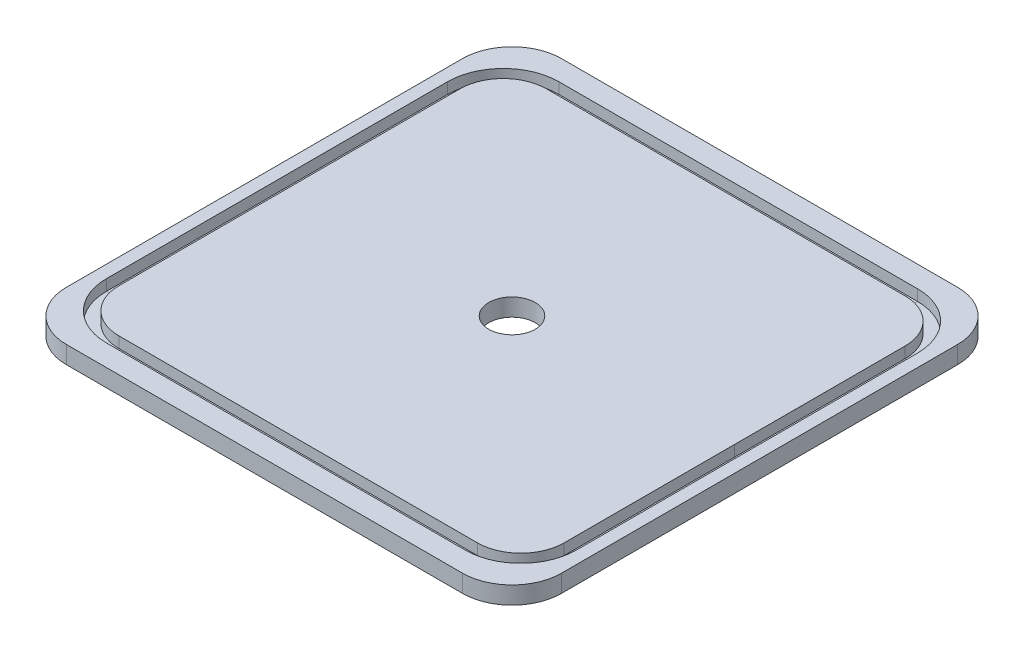
ISO-10303-21;
HEADER;
FILE_DESCRIPTION(('STEP AP214'),'2;1');
FILE_NAME('part.step','',(''),(''),'','','');
FILE_SCHEMA(('AUTOMOTIVE_DESIGN { 1 0 10303 214 1 1 1 1 }'));
ENDSEC;
DATA;
#1=APPLICATION_CONTEXT('core data for automotive mechanical design processes');
#2=APPLICATION_PROTOCOL_DEFINITION('international standard','automotive_design',2000,#1);
#3=PRODUCT_CONTEXT('',#1,'mechanical');
#4=PRODUCT('Part','Part','',(#3));
#5=PRODUCT_RELATED_PRODUCT_CATEGORY('part','',(#4));
#6=PRODUCT_DEFINITION_FORMATION('','',#4);
#7=PRODUCT_DEFINITION_CONTEXT('part definition',#1,'design');
#8=PRODUCT_DEFINITION('design','',#6,#7);
#9=PRODUCT_DEFINITION_SHAPE('','',#8);
#10=(LENGTH_UNIT() NAMED_UNIT(*) SI_UNIT(.MILLI.,.METRE.));
#11=(NAMED_UNIT(*) PLANE_ANGLE_UNIT() SI_UNIT($,.RADIAN.));
#12=(NAMED_UNIT(*) SI_UNIT($,.STERADIAN.) SOLID_ANGLE_UNIT());
#13=UNCERTAINTY_MEASURE_WITH_UNIT(LENGTH_MEASURE(1.E-05),#10,'distance_accuracy_value','');
#14=(GEOMETRIC_REPRESENTATION_CONTEXT(3) GLOBAL_UNCERTAINTY_ASSIGNED_CONTEXT((#13)) GLOBAL_UNIT_ASSIGNED_CONTEXT((#10,
#11,#12)) REPRESENTATION_CONTEXT('',''));
#15=CARTESIAN_POINT('',(0.,0.,0.));
#16=DIRECTION('',(0.,0.,1.));
#17=DIRECTION('',(1.,0.,0.));
#18=AXIS2_PLACEMENT_3D('',#15,#16,#17);
#19=CARTESIAN_POINT('',(50.8,2.25,50.8));
#20=DIRECTION('',(0.,1.,0.));
#21=DIRECTION('',(0.,0.,1.));
#22=AXIS2_PLACEMENT_3D('',#19,#20,#21);
#23=PLANE('',#22);
#24=DIRECTION('',(0.,0.,1.));
#25=VECTOR('',#24,1.);
#26=CARTESIAN_POINT('',(60.2809892067048,2.25,-43.7388));
#27=LINE('',#26,#25);
#28=CARTESIAN_POINT('',(60.2809892067048,2.25,-43.7388));
#29=VERTEX_POINT('',#28);
#30=CARTESIAN_POINT('',(60.2809892067048,2.25,0.));
#31=VERTEX_POINT('',#30);
#32=EDGE_CURVE('E364',#29,#31,#27,.T.);
#33=ORIENTED_EDGE('',*,*,#32,.T.);
#34=DIRECTION('',(0.,0.,1.));
#35=VECTOR('',#34,1.);
#36=CARTESIAN_POINT('',(60.2809892067048,2.25,0.));
#37=LINE('',#36,#35);
#38=CARTESIAN_POINT('',(60.2809892067048,2.25,43.7388));
#39=VERTEX_POINT('',#38);
#40=EDGE_CURVE('E253',#31,#39,#37,.T.);
#41=ORIENTED_EDGE('',*,*,#40,.T.);
#42=CARTESIAN_POINT('',(45.9922192067048,2.25,43.7388));
#43=DIRECTION('',(0.,-1.,0.));
#44=DIRECTION('',(1.,0.,0.));
#45=AXIS2_PLACEMENT_3D('',#42,#43,#44);
#46=CIRCLE('',#45,14.28877);
#47=CARTESIAN_POINT('',(45.9922192067048,2.25,58.02757));
#48=VERTEX_POINT('',#47);
#49=EDGE_CURVE('E264',#39,#48,#46,.T.);
#50=ORIENTED_EDGE('',*,*,#49,.T.);
#51=DIRECTION('',(-1.,0.,0.));
#52=VECTOR('',#51,1.);
#53=CARTESIAN_POINT('',(45.9922192067048,2.25,58.02757));
#54=LINE('',#53,#52);
#55=CARTESIAN_POINT('',(-45.9922192067048,2.25,58.02757));
#56=VERTEX_POINT('',#55);
#57=EDGE_CURVE('E275',#48,#56,#54,.T.);
#58=ORIENTED_EDGE('',*,*,#57,.T.);
#59=CARTESIAN_POINT('',(-45.9922192067048,2.25,43.7388));
#60=DIRECTION('',(0.,-1.,0.));
#61=DIRECTION('',(0.,0.,1.));
#62=AXIS2_PLACEMENT_3D('',#59,#60,#61);
#63=CIRCLE('',#62,14.28877);
#64=CARTESIAN_POINT('',(-60.2809892067048,2.25,43.7388));
#65=VERTEX_POINT('',#64);
#66=EDGE_CURVE('E286',#56,#65,#63,.T.);
#67=ORIENTED_EDGE('',*,*,#66,.T.);
#68=DIRECTION('',(0.,0.,-1.));
#69=VECTOR('',#68,1.);
#70=CARTESIAN_POINT('',(-60.2809892067048,2.25,43.7388));
#71=LINE('',#70,#69);
#72=CARTESIAN_POINT('',(-60.2809892067048,2.25,-43.7388));
#73=VERTEX_POINT('',#72);
#74=EDGE_CURVE('E280',#65,#73,#71,.T.);
#75=ORIENTED_EDGE('',*,*,#74,.T.);
#76=CARTESIAN_POINT('',(-45.9922192067048,2.25,-43.7388));
#77=DIRECTION('',(0.,-1.,0.));
#78=DIRECTION('',(-1.,0.,0.));
#79=AXIS2_PLACEMENT_3D('',#76,#77,#78);
#80=CIRCLE('',#79,14.28877);
#81=CARTESIAN_POINT('',(-45.9922192067048,2.25,-58.02757));
#82=VERTEX_POINT('',#81);
#83=EDGE_CURVE('E308',#73,#82,#80,.T.);
#84=ORIENTED_EDGE('',*,*,#83,.T.);
#85=DIRECTION('',(1.,0.,0.));
#86=VECTOR('',#85,1.);
#87=CARTESIAN_POINT('',(-45.9922192067048,2.25,-58.02757));
#88=LINE('',#87,#86);
#89=CARTESIAN_POINT('',(45.9922192067048,2.25,-58.02757));
#90=VERTEX_POINT('',#89);
#91=EDGE_CURVE('E315',#82,#90,#88,.T.);
#92=ORIENTED_EDGE('',*,*,#91,.T.);
#93=CARTESIAN_POINT('',(45.9922192067048,2.25,-43.7388));
#94=DIRECTION('',(0.,-1.,0.));
#95=DIRECTION('',(0.,0.,-1.));
#96=AXIS2_PLACEMENT_3D('',#93,#94,#95);
#97=CIRCLE('',#96,14.28877);
#98=EDGE_CURVE('E218',#90,#29,#97,.T.);
#99=ORIENTED_EDGE('',*,*,#98,.T.);
#100=EDGE_LOOP('',(#33,#41,#50,#58,#67,#75,#84,#92,#99));
#101=FACE_BOUND('',#100,.T.);
#102=CARTESIAN_POINT('',(50.8,2.25,50.8));
#103=DIRECTION('',(0.,1.,0.));
#104=DIRECTION('',(0.,0.,1.));
#105=AXIS2_PLACEMENT_3D('',#102,#103,#104);
#106=CIRCLE('',#105,12.7);
#107=CARTESIAN_POINT('',(50.8,2.25,63.5));
#108=VERTEX_POINT('',#107);
#109=CARTESIAN_POINT('',(63.5,2.25,50.8));
#110=VERTEX_POINT('',#109);
#111=EDGE_CURVE('E406',#108,#110,#106,.T.);
#112=ORIENTED_EDGE('',*,*,#111,.T.);
#113=DIRECTION('',(0.,0.,-1.));
#114=VECTOR('',#113,1.);
#115=CARTESIAN_POINT('',(63.5,2.25,50.8));
#116=LINE('',#115,#114);
#117=CARTESIAN_POINT('',(63.5,2.25,-50.8000000000001));
#118=VERTEX_POINT('',#117);
#119=EDGE_CURVE('E409',#110,#118,#116,.T.);
#120=ORIENTED_EDGE('',*,*,#119,.T.);
#121=CARTESIAN_POINT('',(50.8,2.25,-50.8));
#122=DIRECTION('',(0.,1.,0.));
#123=DIRECTION('',(0.,0.,1.));
#124=AXIS2_PLACEMENT_3D('',#121,#122,#123);
#125=CIRCLE('',#124,12.7);
#126=CARTESIAN_POINT('',(50.7999999999999,2.25,-63.5));
#127=VERTEX_POINT('',#126);
#128=EDGE_CURVE('E412',#118,#127,#125,.T.);
#129=ORIENTED_EDGE('',*,*,#128,.T.);
#130=DIRECTION('',(-1.,0.,0.));
#131=VECTOR('',#130,1.);
#132=CARTESIAN_POINT('',(50.7999999999999,2.25,-63.5));
#133=LINE('',#132,#131);
#134=CARTESIAN_POINT('',(-50.7999999999999,2.25,-63.5));
#135=VERTEX_POINT('',#134);
#136=EDGE_CURVE('E414',#127,#135,#133,.T.);
#137=ORIENTED_EDGE('',*,*,#136,.T.);
#138=CARTESIAN_POINT('',(-50.8,2.25,-50.8));
#139=DIRECTION('',(0.,1.,0.));
#140=DIRECTION('',(0.,0.,-1.));
#141=AXIS2_PLACEMENT_3D('',#138,#139,#140);
#142=CIRCLE('',#141,12.7);
#143=CARTESIAN_POINT('',(-63.5,2.25,-50.8000000000001));
#144=VERTEX_POINT('',#143);
#145=EDGE_CURVE('E416',#135,#144,#142,.T.);
#146=ORIENTED_EDGE('',*,*,#145,.T.);
#147=DIRECTION('',(0.,0.,1.));
#148=VECTOR('',#147,1.);
#149=CARTESIAN_POINT('',(-63.5,2.25,-50.8000000000001));
#150=LINE('',#149,#148);
#151=CARTESIAN_POINT('',(-63.5,2.25,50.8));
#152=VERTEX_POINT('',#151);
#153=EDGE_CURVE('E418',#144,#152,#150,.T.);
#154=ORIENTED_EDGE('',*,*,#153,.T.);
#155=CARTESIAN_POINT('',(-50.8,2.25,50.8));
#156=DIRECTION('',(0.,1.,0.));
#157=DIRECTION('',(0.,0.,1.));
#158=AXIS2_PLACEMENT_3D('',#155,#156,#157);
#159=CIRCLE('',#158,12.7);
#160=CARTESIAN_POINT('',(-50.7999999999999,2.25,63.5));
#161=VERTEX_POINT('',#160);
#162=EDGE_CURVE('E420',#152,#161,#159,.T.);
#163=ORIENTED_EDGE('',*,*,#162,.T.);
#164=DIRECTION('',(1.,0.,0.));
#165=VECTOR('',#164,1.);
#166=CARTESIAN_POINT('',(-50.7999999999999,2.25,63.5));
#167=LINE('',#166,#165);
#168=EDGE_CURVE('E422',#161,#108,#167,.T.);
#169=ORIENTED_EDGE('',*,*,#168,.T.);
#170=EDGE_LOOP('',(#112,#120,#129,#137,#146,#154,#163,#169));
#171=FACE_BOUND('',#170,.T.);
#172=ADVANCED_FACE('F35',(#101,#171),#23,.T.);
#173=CARTESIAN_POINT('',(50.8,2.25,50.8));
#174=DIRECTION('',(0.,-1.,0.));
#175=DIRECTION('',(0.,0.,-1.));
#176=AXIS2_PLACEMENT_3D('',#173,#174,#175);
#177=CYLINDRICAL_SURFACE('',#176,12.7);
#178=CARTESIAN_POINT('',(50.8,-2.25,50.8));
#179=DIRECTION('',(0.,1.,0.));
#180=DIRECTION('',(0.,0.,1.));
#181=AXIS2_PLACEMENT_3D('',#178,#179,#180);
#182=CIRCLE('',#181,12.7);
#183=CARTESIAN_POINT('',(50.8,-2.25,63.5));
#184=VERTEX_POINT('',#183);
#185=CARTESIAN_POINT('',(63.5,-2.25,50.8));
#186=VERTEX_POINT('',#185);
#187=EDGE_CURVE('E405',#184,#186,#182,.T.);
#188=ORIENTED_EDGE('',*,*,#187,.T.);
#189=DIRECTION('',(0.,-1.,0.));
#190=VECTOR('',#189,1.);
#191=CARTESIAN_POINT('',(63.5,2.25,50.8));
#192=LINE('',#191,#190);
#193=EDGE_CURVE('E11',#110,#186,#192,.T.);
#194=ORIENTED_EDGE('',*,*,#193,.F.);
#195=ORIENTED_EDGE('',*,*,#111,.F.);
#196=DIRECTION('',(0.,-1.,0.));
#197=VECTOR('',#196,1.);
#198=CARTESIAN_POINT('',(50.8,2.25,63.5));
#199=LINE('',#198,#197);
#200=EDGE_CURVE('E424',#108,#184,#199,.T.);
#201=ORIENTED_EDGE('',*,*,#200,.T.);
#202=EDGE_LOOP('',(#188,#194,#195,#201));
#203=FACE_BOUND('',#202,.T.);
#204=ADVANCED_FACE('F37',(#203),#177,.T.);
#205=CARTESIAN_POINT('',(63.5,2.25,50.8));
#206=DIRECTION('',(-1.,0.,0.));
#207=DIRECTION('',(0.,0.,1.));
#208=AXIS2_PLACEMENT_3D('',#205,#206,#207);
#209=PLANE('',#208);
#210=DIRECTION('',(0.,0.,-1.));
#211=VECTOR('',#210,1.);
#212=CARTESIAN_POINT('',(63.5,-2.25,50.8));
#213=LINE('',#212,#211);
#214=CARTESIAN_POINT('',(63.5,-2.25,-50.8000000000001));
#215=VERTEX_POINT('',#214);
#216=EDGE_CURVE('E427',#186,#215,#213,.T.);
#217=ORIENTED_EDGE('',*,*,#216,.T.);
#218=DIRECTION('',(0.,-1.,0.));
#219=VECTOR('',#218,1.);
#220=CARTESIAN_POINT('',(63.5,2.25,-50.8000000000001));
#221=LINE('',#220,#219);
#222=EDGE_CURVE('E43',#118,#215,#221,.T.);
#223=ORIENTED_EDGE('',*,*,#222,.F.);
#224=ORIENTED_EDGE('',*,*,#119,.F.);
#225=ORIENTED_EDGE('',*,*,#193,.T.);
#226=EDGE_LOOP('',(#217,#223,#224,#225));
#227=FACE_BOUND('',#226,.T.);
#228=ADVANCED_FACE('F483',(#227),#209,.F.);
#229=CARTESIAN_POINT('',(50.8,2.25,-50.8));
#230=DIRECTION('',(0.,-1.,0.));
#231=DIRECTION('',(0.,0.,-1.));
#232=AXIS2_PLACEMENT_3D('',#229,#230,#231);
#233=CYLINDRICAL_SURFACE('',#232,12.7);
#234=CARTESIAN_POINT('',(50.8,-2.25,-50.8));
#235=DIRECTION('',(0.,1.,0.));
#236=DIRECTION('',(0.,0.,1.));
#237=AXIS2_PLACEMENT_3D('',#234,#235,#236);
#238=CIRCLE('',#237,12.7);
#239=CARTESIAN_POINT('',(50.7999999999999,-2.25,-63.5));
#240=VERTEX_POINT('',#239);
#241=EDGE_CURVE('E429',#215,#240,#238,.T.);
#242=ORIENTED_EDGE('',*,*,#241,.T.);
#243=DIRECTION('',(0.,-1.,0.));
#244=VECTOR('',#243,1.);
#245=CARTESIAN_POINT('',(50.7999999999999,2.25,-63.5));
#246=LINE('',#245,#244);
#247=EDGE_CURVE('E454',#127,#240,#246,.T.);
#248=ORIENTED_EDGE('',*,*,#247,.F.);
#249=ORIENTED_EDGE('',*,*,#128,.F.);
#250=ORIENTED_EDGE('',*,*,#222,.T.);
#251=EDGE_LOOP('',(#242,#248,#249,#250));
#252=FACE_BOUND('',#251,.T.);
#253=ADVANCED_FACE('F461',(#252),#233,.T.);
#254=CARTESIAN_POINT('',(50.7999999999999,2.25,-63.5));
#255=DIRECTION('',(0.,0.,1.));
#256=DIRECTION('',(1.,0.,0.));
#257=AXIS2_PLACEMENT_3D('',#254,#255,#256);
#258=PLANE('',#257);
#259=DIRECTION('',(-1.,0.,0.));
#260=VECTOR('',#259,1.);
#261=CARTESIAN_POINT('',(50.7999999999999,-2.25,-63.5));
#262=LINE('',#261,#260);
#263=CARTESIAN_POINT('',(-50.7999999999999,-2.25,-63.5));
#264=VERTEX_POINT('',#263);
#265=EDGE_CURVE('E431',#240,#264,#262,.T.);
#266=ORIENTED_EDGE('',*,*,#265,.T.);
#267=DIRECTION('',(0.,-1.,0.));
#268=VECTOR('',#267,1.);
#269=CARTESIAN_POINT('',(-50.7999999999999,2.25,-63.5));
#270=LINE('',#269,#268);
#271=EDGE_CURVE('E451',#135,#264,#270,.T.);
#272=ORIENTED_EDGE('',*,*,#271,.F.);
#273=ORIENTED_EDGE('',*,*,#136,.F.);
#274=ORIENTED_EDGE('',*,*,#247,.T.);
#275=EDGE_LOOP('',(#266,#272,#273,#274));
#276=FACE_BOUND('',#275,.T.);
#277=ADVANCED_FACE('F472',(#276),#258,.F.);
#278=CARTESIAN_POINT('',(-50.8,2.25,-50.8));
#279=DIRECTION('',(0.,-1.,0.));
#280=DIRECTION('',(0.,0.,-1.));
#281=AXIS2_PLACEMENT_3D('',#278,#279,#280);
#282=CYLINDRICAL_SURFACE('',#281,12.7);
#283=CARTESIAN_POINT('',(-50.8,-2.25,-50.8));
#284=DIRECTION('',(0.,1.,0.));
#285=DIRECTION('',(0.,0.,-1.));
#286=AXIS2_PLACEMENT_3D('',#283,#284,#285);
#287=CIRCLE('',#286,12.7);
#288=CARTESIAN_POINT('',(-63.5,-2.25,-50.8000000000001));
#289=VERTEX_POINT('',#288);
#290=EDGE_CURVE('E433',#264,#289,#287,.T.);
#291=ORIENTED_EDGE('',*,*,#290,.T.);
#292=DIRECTION('',(0.,-1.,0.));
#293=VECTOR('',#292,1.);
#294=CARTESIAN_POINT('',(-63.5,2.25,-50.8000000000001));
#295=LINE('',#294,#293);
#296=EDGE_CURVE('E448',#144,#289,#295,.T.);
#297=ORIENTED_EDGE('',*,*,#296,.F.);
#298=ORIENTED_EDGE('',*,*,#145,.F.);
#299=ORIENTED_EDGE('',*,*,#271,.T.);
#300=EDGE_LOOP('',(#291,#297,#298,#299));
#301=FACE_BOUND('',#300,.T.);
#302=ADVANCED_FACE('F476',(#301),#282,.T.);
#303=CARTESIAN_POINT('',(-63.5,2.25,-50.8000000000001));
#304=DIRECTION('',(1.,0.,0.));
#305=DIRECTION('',(0.,0.,-1.));
#306=AXIS2_PLACEMENT_3D('',#303,#304,#305);
#307=PLANE('',#306);
#308=DIRECTION('',(0.,0.,1.));
#309=VECTOR('',#308,1.);
#310=CARTESIAN_POINT('',(-63.5,-2.25,-50.8000000000001));
#311=LINE('',#310,#309);
#312=CARTESIAN_POINT('',(-63.5,-2.25,50.8));
#313=VERTEX_POINT('',#312);
#314=EDGE_CURVE('E435',#289,#313,#311,.T.);
#315=ORIENTED_EDGE('',*,*,#314,.T.);
#316=DIRECTION('',(0.,-1.,0.));
#317=VECTOR('',#316,1.);
#318=CARTESIAN_POINT('',(-63.5,2.25,50.8));
#319=LINE('',#318,#317);
#320=EDGE_CURVE('E445',#152,#313,#319,.T.);
#321=ORIENTED_EDGE('',*,*,#320,.F.);
#322=ORIENTED_EDGE('',*,*,#153,.F.);
#323=ORIENTED_EDGE('',*,*,#296,.T.);
#324=EDGE_LOOP('',(#315,#321,#322,#323));
#325=FACE_BOUND('',#324,.T.);
#326=ADVANCED_FACE('F496',(#325),#307,.F.);
#327=CARTESIAN_POINT('',(-50.8,2.25,50.8));
#328=DIRECTION('',(0.,-1.,0.));
#329=DIRECTION('',(0.,0.,-1.));
#330=AXIS2_PLACEMENT_3D('',#327,#328,#329);
#331=CYLINDRICAL_SURFACE('',#330,12.7);
#332=CARTESIAN_POINT('',(-50.8,-2.25,50.8));
#333=DIRECTION('',(0.,1.,0.));
#334=DIRECTION('',(0.,0.,1.));
#335=AXIS2_PLACEMENT_3D('',#332,#333,#334);
#336=CIRCLE('',#335,12.7);
#337=CARTESIAN_POINT('',(-50.7999999999999,-2.25,63.5));
#338=VERTEX_POINT('',#337);
#339=EDGE_CURVE('E437',#313,#338,#336,.T.);
#340=ORIENTED_EDGE('',*,*,#339,.T.);
#341=DIRECTION('',(0.,-1.,0.));
#342=VECTOR('',#341,1.);
#343=CARTESIAN_POINT('',(-50.7999999999999,2.25,63.5));
#344=LINE('',#343,#342);
#345=EDGE_CURVE('E442',#161,#338,#344,.T.);
#346=ORIENTED_EDGE('',*,*,#345,.F.);
#347=ORIENTED_EDGE('',*,*,#162,.F.);
#348=ORIENTED_EDGE('',*,*,#320,.T.);
#349=EDGE_LOOP('',(#340,#346,#347,#348));
#350=FACE_BOUND('',#349,.T.);
#351=ADVANCED_FACE('F494',(#350),#331,.T.);
#352=CARTESIAN_POINT('',(-50.7999999999999,2.25,63.5));
#353=DIRECTION('',(0.,0.,-1.));
#354=DIRECTION('',(-1.,0.,0.));
#355=AXIS2_PLACEMENT_3D('',#352,#353,#354);
#356=PLANE('',#355);
#357=DIRECTION('',(1.,0.,0.));
#358=VECTOR('',#357,1.);
#359=CARTESIAN_POINT('',(-50.7999999999999,-2.25,63.5));
#360=LINE('',#359,#358);
#361=EDGE_CURVE('E410',#338,#184,#360,.T.);
#362=ORIENTED_EDGE('',*,*,#361,.T.);
#363=ORIENTED_EDGE('',*,*,#200,.F.);
#364=ORIENTED_EDGE('',*,*,#168,.F.);
#365=ORIENTED_EDGE('',*,*,#345,.T.);
#366=EDGE_LOOP('',(#362,#363,#364,#365));
#367=FACE_BOUND('',#366,.T.);
#368=ADVANCED_FACE('F489',(#367),#356,.F.);
#369=CARTESIAN_POINT('',(45.9922192067048,2.25,-43.7388));
#370=DIRECTION('',(0.,-1.,0.));
#371=DIRECTION('',(0.,0.,-1.));
#372=AXIS2_PLACEMENT_3D('',#369,#370,#371);
#373=CIRCLE('',#372,11.11123);
#374=CARTESIAN_POINT('',(45.9922192067048,2.25,-54.85003));
#375=VERTEX_POINT('',#374);
#376=CARTESIAN_POINT('',(57.1034492067048,2.25,-43.7388));
#377=VERTEX_POINT('',#376);
#378=EDGE_CURVE('E58',#375,#377,#373,.T.);
#379=ORIENTED_EDGE('',*,*,#378,.F.);
#380=DIRECTION('',(1.,0.,0.));
#381=VECTOR('',#380,1.);
#382=CARTESIAN_POINT('',(-45.9922192067048,2.25,-54.85003));
#383=LINE('',#382,#381);
#384=CARTESIAN_POINT('',(-45.9922192067048,2.25,-54.85003));
#385=VERTEX_POINT('',#384);
#386=EDGE_CURVE('E302',#385,#375,#383,.T.);
#387=ORIENTED_EDGE('',*,*,#386,.F.);
#388=CARTESIAN_POINT('',(-45.9922192067048,2.25,-43.7388));
#389=DIRECTION('',(0.,-1.,0.));
#390=DIRECTION('',(-1.,0.,0.));
#391=AXIS2_PLACEMENT_3D('',#388,#389,#390);
#392=CIRCLE('',#391,11.11123);
#393=CARTESIAN_POINT('',(-57.1034492067048,2.25,-43.7388));
#394=VERTEX_POINT('',#393);
#395=EDGE_CURVE('E291',#394,#385,#392,.T.);
#396=ORIENTED_EDGE('',*,*,#395,.F.);
#397=DIRECTION('',(0.,0.,-1.));
#398=VECTOR('',#397,1.);
#399=CARTESIAN_POINT('',(-57.1034492067048,2.25,43.7388));
#400=LINE('',#399,#398);
#401=CARTESIAN_POINT('',(-57.1034492067048,2.25,43.7388));
#402=VERTEX_POINT('',#401);
#403=EDGE_CURVE('E284',#402,#394,#400,.T.);
#404=ORIENTED_EDGE('',*,*,#403,.F.);
#405=CARTESIAN_POINT('',(-45.9922192067048,2.25,43.7388));
#406=DIRECTION('',(0.,-1.,0.));
#407=DIRECTION('',(0.,0.,1.));
#408=AXIS2_PLACEMENT_3D('',#405,#406,#407);
#409=CIRCLE('',#408,11.11123);
#410=CARTESIAN_POINT('',(-45.9922192067048,2.25,54.85003));
#411=VERTEX_POINT('',#410);
#412=EDGE_CURVE('E269',#411,#402,#409,.T.);
#413=ORIENTED_EDGE('',*,*,#412,.F.);
#414=DIRECTION('',(-1.,0.,0.));
#415=VECTOR('',#414,1.);
#416=CARTESIAN_POINT('',(45.9922192067048,2.25,54.85003));
#417=LINE('',#416,#415);
#418=CARTESIAN_POINT('',(45.9922192067048,2.25,54.85003));
#419=VERTEX_POINT('',#418);
#420=EDGE_CURVE('E258',#419,#411,#417,.T.);
#421=ORIENTED_EDGE('',*,*,#420,.F.);
#422=CARTESIAN_POINT('',(45.9922192067048,2.25,43.7388));
#423=DIRECTION('',(0.,-1.,0.));
#424=DIRECTION('',(1.,0.,0.));
#425=AXIS2_PLACEMENT_3D('',#422,#423,#424);
#426=CIRCLE('',#425,11.11123);
#427=CARTESIAN_POINT('',(57.1034492067048,2.25,43.7388));
#428=VERTEX_POINT('',#427);
#429=EDGE_CURVE('E236',#428,#419,#426,.T.);
#430=ORIENTED_EDGE('',*,*,#429,.F.);
#431=DIRECTION('',(0.,0.,1.));
#432=VECTOR('',#431,1.);
#433=CARTESIAN_POINT('',(57.1034492067048,2.25,0.));
#434=LINE('',#433,#432);
#435=CARTESIAN_POINT('',(57.1034492067048,2.25,0.));
#436=VERTEX_POINT('',#435);
#437=EDGE_CURVE('E225',#436,#428,#434,.T.);
#438=ORIENTED_EDGE('',*,*,#437,.F.);
#439=DIRECTION('',(0.,0.,1.));
#440=VECTOR('',#439,1.);
#441=CARTESIAN_POINT('',(57.1034492067048,2.25,-43.7388));
#442=LINE('',#441,#440);
#443=EDGE_CURVE('E210',#377,#436,#442,.T.);
#444=ORIENTED_EDGE('',*,*,#443,.F.);
#445=EDGE_LOOP('',(#379,#387,#396,#404,#413,#421,#430,#438,#444));
#446=FACE_BOUND('',#445,.T.);
#447=CARTESIAN_POINT('',(0.,2.25,0.));
#448=DIRECTION('',(0.,1.,0.));
#449=DIRECTION('',(0.,0.,1.));
#450=AXIS2_PLACEMENT_3D('',#447,#448,#449);
#451=CIRCLE('',#450,5.953125);
#452=CARTESIAN_POINT('',(0.,2.25,5.95312499999999));
#453=VERTEX_POINT('',#452);
#454=EDGE_CURVE('E399',#453,#453,#451,.T.);
#455=ORIENTED_EDGE('',*,*,#454,.F.);
#456=EDGE_LOOP('',(#455));
#457=FACE_BOUND('',#456,.T.);
#458=ADVANCED_FACE('F232',(#446,#457),#23,.T.);
#459=CARTESIAN_POINT('',(50.8,-2.25,50.8));
#460=DIRECTION('',(0.,1.,0.));
#461=DIRECTION('',(0.,0.,1.));
#462=AXIS2_PLACEMENT_3D('',#459,#460,#461);
#463=PLANE('',#462);
#464=CARTESIAN_POINT('',(0.,-2.25,0.));
#465=DIRECTION('',(0.,1.,0.));
#466=DIRECTION('',(0.,0.,1.));
#467=AXIS2_PLACEMENT_3D('',#464,#465,#466);
#468=CIRCLE('',#467,5.953125);
#469=CARTESIAN_POINT('',(0.,-2.25,5.95312499999999));
#470=VERTEX_POINT('',#469);
#471=EDGE_CURVE('E402',#470,#470,#468,.F.);
#472=ORIENTED_EDGE('',*,*,#471,.F.);
#473=EDGE_LOOP('',(#472));
#474=FACE_BOUND('',#473,.T.);
#475=ORIENTED_EDGE('',*,*,#187,.F.);
#476=ORIENTED_EDGE('',*,*,#361,.F.);
#477=ORIENTED_EDGE('',*,*,#339,.F.);
#478=ORIENTED_EDGE('',*,*,#314,.F.);
#479=ORIENTED_EDGE('',*,*,#290,.F.);
#480=ORIENTED_EDGE('',*,*,#265,.F.);
#481=ORIENTED_EDGE('',*,*,#241,.F.);
#482=ORIENTED_EDGE('',*,*,#216,.F.);
#483=EDGE_LOOP('',(#475,#476,#477,#478,#479,#480,#481,#482));
#484=FACE_BOUND('',#483,.T.);
#485=ADVANCED_FACE('F467',(#474,#484),#463,.F.);
#486=CARTESIAN_POINT('',(0.,-19.0879802270047,0.));
#487=DIRECTION('',(0.,1.,0.));
#488=DIRECTION('',(0.,0.,1.));
#489=AXIS2_PLACEMENT_3D('',#486,#487,#488);
#490=CYLINDRICAL_SURFACE('',#489,5.953125);
#491=ORIENTED_EDGE('',*,*,#471,.T.);
#492=EDGE_LOOP('',(#491));
#493=FACE_BOUND('',#492,.T.);
#494=ORIENTED_EDGE('',*,*,#454,.T.);
#495=EDGE_LOOP('',(#494));
#496=FACE_BOUND('',#495,.T.);
#497=ADVANCED_FACE('F518',(#493,#496),#490,.F.);
#498=CARTESIAN_POINT('',(60.2809892067048,2.25,-43.7388));
#499=DIRECTION('',(1.,0.,0.));
#500=DIRECTION('',(0.,0.,-1.));
#501=AXIS2_PLACEMENT_3D('',#498,#499,#500);
#502=PLANE('',#501);
#503=DIRECTION('',(0.,0.,1.));
#504=VECTOR('',#503,1.);
#505=CARTESIAN_POINT('',(60.2809892067048,-0.574480000000004,-43.7388));
#506=LINE('',#505,#504);
#507=CARTESIAN_POINT('',(60.2809892067048,-0.574480000000004,-43.7388));
#508=VERTEX_POINT('',#507);
#509=CARTESIAN_POINT('',(60.2809892067048,-0.574480000000004,0.));
#510=VERTEX_POINT('',#509);
#511=EDGE_CURVE('E316',#508,#510,#506,.T.);
#512=ORIENTED_EDGE('',*,*,#511,.T.);
#513=DIRECTION('',(0.,1.,0.));
#514=VECTOR('',#513,1.);
#515=CARTESIAN_POINT('',(60.2809892067048,2.25,0.));
#516=LINE('',#515,#514);
#517=EDGE_CURVE('E238',#510,#31,#516,.T.);
#518=ORIENTED_EDGE('',*,*,#517,.T.);
#519=ORIENTED_EDGE('',*,*,#32,.F.);
#520=DIRECTION('',(0.,1.,0.));
#521=VECTOR('',#520,1.);
#522=CARTESIAN_POINT('',(60.2809892067048,2.25,-43.7388));
#523=LINE('',#522,#521);
#524=EDGE_CURVE('E363',#508,#29,#523,.T.);
#525=ORIENTED_EDGE('',*,*,#524,.F.);
#526=EDGE_LOOP('',(#512,#518,#519,#525));
#527=FACE_BOUND('',#526,.T.);
#528=ADVANCED_FACE('F588',(#527),#502,.F.);
#529=CARTESIAN_POINT('',(60.2809892067048,-0.574480000000004,-43.7388));
#530=DIRECTION('',(0.,-1.,0.));
#531=DIRECTION('',(1.,0.,0.));
#532=AXIS2_PLACEMENT_3D('',#529,#530,#531);
#533=PLANE('',#532);
#534=DIRECTION('',(0.,0.,1.));
#535=VECTOR('',#534,1.);
#536=CARTESIAN_POINT('',(57.1034492067048,-0.574480000000005,-43.7388));
#537=LINE('',#536,#535);
#538=CARTESIAN_POINT('',(57.1034492067048,-0.574480000000005,-43.7388));
#539=VERTEX_POINT('',#538);
#540=CARTESIAN_POINT('',(57.1034492067048,-0.574480000000005,0.));
#541=VERTEX_POINT('',#540);
#542=EDGE_CURVE('E217',#539,#541,#537,.T.);
#543=ORIENTED_EDGE('',*,*,#542,.T.);
#544=DIRECTION('',(1.,0.,0.));
#545=VECTOR('',#544,1.);
#546=CARTESIAN_POINT('',(60.2809892067048,-0.574480000000004,0.));
#547=LINE('',#546,#545);
#548=EDGE_CURVE('E230',#541,#510,#547,.T.);
#549=ORIENTED_EDGE('',*,*,#548,.T.);
#550=ORIENTED_EDGE('',*,*,#511,.F.);
#551=DIRECTION('',(1.,0.,0.));
#552=VECTOR('',#551,1.);
#553=CARTESIAN_POINT('',(60.2809892067048,-0.574480000000004,-43.7388));
#554=LINE('',#553,#552);
#555=EDGE_CURVE('E313',#539,#508,#554,.T.);
#556=ORIENTED_EDGE('',*,*,#555,.F.);
#557=EDGE_LOOP('',(#543,#549,#550,#556));
#558=FACE_BOUND('',#557,.T.);
#559=ADVANCED_FACE('F599',(#558),#533,.F.);
#560=CARTESIAN_POINT('',(45.9922192067048,2.25,-43.7388));
#561=DIRECTION('',(0.,-1.,0.));
#562=DIRECTION('',(0.,0.,-1.));
#563=AXIS2_PLACEMENT_3D('',#560,#561,#562);
#564=CYLINDRICAL_SURFACE('',#563,14.28877);
#565=ORIENTED_EDGE('',*,*,#98,.F.);
#566=DIRECTION('',(0.,1.,0.));
#567=VECTOR('',#566,1.);
#568=CARTESIAN_POINT('',(45.9922192067048,2.25,-58.02757));
#569=LINE('',#568,#567);
#570=CARTESIAN_POINT('',(45.9922192067048,-0.574480000000004,-58.02757));
#571=VERTEX_POINT('',#570);
#572=EDGE_CURVE('E357',#571,#90,#569,.T.);
#573=ORIENTED_EDGE('',*,*,#572,.F.);
#574=CARTESIAN_POINT('',(45.9922192067048,-0.574480000000004,-43.7388));
#575=DIRECTION('',(0.,-1.,0.));
#576=DIRECTION('',(0.,0.,-1.));
#577=AXIS2_PLACEMENT_3D('',#574,#575,#576);
#578=CIRCLE('',#577,14.28877);
#579=EDGE_CURVE('E360',#571,#508,#578,.T.);
#580=ORIENTED_EDGE('',*,*,#579,.T.);
#581=ORIENTED_EDGE('',*,*,#524,.T.);
#582=EDGE_LOOP('',(#565,#573,#580,#581));
#583=FACE_BOUND('',#582,.T.);
#584=ADVANCED_FACE('F608',(#583),#564,.F.);
#585=CARTESIAN_POINT('',(45.9922192067048,-0.574480000000005,-58.02757));
#586=DIRECTION('',(0.,-1.,0.));
#587=DIRECTION('',(0.,0.,-1.));
#588=AXIS2_PLACEMENT_3D('',#585,#586,#587);
#589=PLANE('',#588);
#590=ORIENTED_EDGE('',*,*,#579,.F.);
#591=DIRECTION('',(0.,0.,-1.));
#592=VECTOR('',#591,1.);
#593=CARTESIAN_POINT('',(45.9922192067048,-0.574480000000004,-58.02757));
#594=LINE('',#593,#592);
#595=CARTESIAN_POINT('',(45.9922192067048,-0.574480000000005,-54.85003));
#596=VERTEX_POINT('',#595);
#597=EDGE_CURVE('E305',#596,#571,#594,.T.);
#598=ORIENTED_EDGE('',*,*,#597,.F.);
#599=CARTESIAN_POINT('',(45.9922192067048,-0.574480000000005,-43.7388));
#600=DIRECTION('',(0.,-1.,0.));
#601=DIRECTION('',(0.,0.,-1.));
#602=AXIS2_PLACEMENT_3D('',#599,#600,#601);
#603=CIRCLE('',#602,11.11123);
#604=EDGE_CURVE('E310',#596,#539,#603,.T.);
#605=ORIENTED_EDGE('',*,*,#604,.T.);
#606=ORIENTED_EDGE('',*,*,#555,.T.);
#607=EDGE_LOOP('',(#590,#598,#605,#606));
#608=FACE_BOUND('',#607,.T.);
#609=ADVANCED_FACE('F617',(#608),#589,.F.);
#610=CARTESIAN_POINT('',(45.9922192067048,2.25,-43.7388));
#611=DIRECTION('',(0.,-1.,0.));
#612=DIRECTION('',(0.,0.,-1.));
#613=AXIS2_PLACEMENT_3D('',#610,#611,#612);
#614=CYLINDRICAL_SURFACE('',#613,11.11123);
#615=ORIENTED_EDGE('',*,*,#604,.F.);
#616=DIRECTION('',(0.,-1.,0.));
#617=VECTOR('',#616,1.);
#618=CARTESIAN_POINT('',(45.9922192067048,2.25,-54.85003));
#619=LINE('',#618,#617);
#620=EDGE_CURVE('E298',#375,#596,#619,.T.);
#621=ORIENTED_EDGE('',*,*,#620,.F.);
#622=ORIENTED_EDGE('',*,*,#378,.T.);
#623=DIRECTION('',(0.,-1.,0.));
#624=VECTOR('',#623,1.);
#625=CARTESIAN_POINT('',(57.1034492067048,2.25,-43.7388));
#626=LINE('',#625,#624);
#627=EDGE_CURVE('E214',#377,#539,#626,.T.);
#628=ORIENTED_EDGE('',*,*,#627,.T.);
#629=EDGE_LOOP('',(#615,#621,#622,#628));
#630=FACE_BOUND('',#629,.T.);
#631=ADVANCED_FACE('F626',(#630),#614,.T.);
#632=CARTESIAN_POINT('',(-45.9922192067048,2.25,-58.02757));
#633=DIRECTION('',(0.,0.,-1.));
#634=DIRECTION('',(-1.,0.,0.));
#635=AXIS2_PLACEMENT_3D('',#632,#633,#634);
#636=PLANE('',#635);
#637=ORIENTED_EDGE('',*,*,#91,.F.);
#638=DIRECTION('',(0.,1.,0.));
#639=VECTOR('',#638,1.);
#640=CARTESIAN_POINT('',(-45.9922192067048,2.25,-58.02757));
#641=LINE('',#640,#639);
#642=CARTESIAN_POINT('',(-45.9922192067048,-0.574480000000004,-58.02757));
#643=VERTEX_POINT('',#642);
#644=EDGE_CURVE('E351',#643,#82,#641,.T.);
#645=ORIENTED_EDGE('',*,*,#644,.F.);
#646=DIRECTION('',(1.,0.,0.));
#647=VECTOR('',#646,1.);
#648=CARTESIAN_POINT('',(-45.9922192067048,-0.574480000000004,-58.02757));
#649=LINE('',#648,#647);
#650=EDGE_CURVE('E354',#643,#571,#649,.T.);
#651=ORIENTED_EDGE('',*,*,#650,.T.);
#652=ORIENTED_EDGE('',*,*,#572,.T.);
#653=EDGE_LOOP('',(#637,#645,#651,#652));
#654=FACE_BOUND('',#653,.T.);
#655=ADVANCED_FACE('F635',(#654),#636,.F.);
#656=CARTESIAN_POINT('',(-45.9922192067048,-0.574480000000004,-58.02757));
#657=DIRECTION('',(0.,-1.,0.));
#658=DIRECTION('',(0.,0.,-1.));
#659=AXIS2_PLACEMENT_3D('',#656,#657,#658);
#660=PLANE('',#659);
#661=ORIENTED_EDGE('',*,*,#650,.F.);
#662=DIRECTION('',(0.,0.,-1.));
#663=VECTOR('',#662,1.);
#664=CARTESIAN_POINT('',(-45.9922192067048,-0.574480000000004,-58.02757));
#665=LINE('',#664,#663);
#666=CARTESIAN_POINT('',(-45.9922192067048,-0.574480000000005,-54.85003));
#667=VERTEX_POINT('',#666);
#668=EDGE_CURVE('E294',#667,#643,#665,.T.);
#669=ORIENTED_EDGE('',*,*,#668,.F.);
#670=DIRECTION('',(1.,0.,0.));
#671=VECTOR('',#670,1.);
#672=CARTESIAN_POINT('',(-45.9922192067048,-0.574480000000005,-54.85003));
#673=LINE('',#672,#671);
#674=EDGE_CURVE('E301',#667,#596,#673,.T.);
#675=ORIENTED_EDGE('',*,*,#674,.T.);
#676=ORIENTED_EDGE('',*,*,#597,.T.);
#677=EDGE_LOOP('',(#661,#669,#675,#676));
#678=FACE_BOUND('',#677,.T.);
#679=ADVANCED_FACE('F643',(#678),#660,.F.);
#680=CARTESIAN_POINT('',(-45.9922192067048,2.25,-54.85003));
#681=DIRECTION('',(0.,0.,1.));
#682=DIRECTION('',(1.,0.,0.));
#683=AXIS2_PLACEMENT_3D('',#680,#681,#682);
#684=PLANE('',#683);
#685=ORIENTED_EDGE('',*,*,#674,.F.);
#686=DIRECTION('',(0.,-1.,0.));
#687=VECTOR('',#686,1.);
#688=CARTESIAN_POINT('',(-45.9922192067048,2.25,-54.85003));
#689=LINE('',#688,#687);
#690=EDGE_CURVE('E287',#385,#667,#689,.T.);
#691=ORIENTED_EDGE('',*,*,#690,.F.);
#692=ORIENTED_EDGE('',*,*,#386,.T.);
#693=ORIENTED_EDGE('',*,*,#620,.T.);
#694=EDGE_LOOP('',(#685,#691,#692,#693));
#695=FACE_BOUND('',#694,.T.);
#696=ADVANCED_FACE('F652',(#695),#684,.F.);
#697=CARTESIAN_POINT('',(-45.9922192067048,2.25,-43.7388));
#698=DIRECTION('',(0.,-1.,0.));
#699=DIRECTION('',(0.,0.,-1.));
#700=AXIS2_PLACEMENT_3D('',#697,#698,#699);
#701=CYLINDRICAL_SURFACE('',#700,14.28877);
#702=ORIENTED_EDGE('',*,*,#83,.F.);
#703=DIRECTION('',(0.,1.,0.));
#704=VECTOR('',#703,1.);
#705=CARTESIAN_POINT('',(-60.2809892067048,2.25,-43.7388));
#706=LINE('',#705,#704);
#707=CARTESIAN_POINT('',(-60.2809892067048,-0.574480000000004,-43.7388));
#708=VERTEX_POINT('',#707);
#709=EDGE_CURVE('E297',#708,#73,#706,.T.);
#710=ORIENTED_EDGE('',*,*,#709,.F.);
#711=CARTESIAN_POINT('',(-45.9922192067048,-0.574480000000004,-43.7388));
#712=DIRECTION('',(0.,-1.,0.));
#713=DIRECTION('',(-1.,0.,0.));
#714=AXIS2_PLACEMENT_3D('',#711,#712,#713);
#715=CIRCLE('',#714,14.28877);
#716=EDGE_CURVE('E348',#708,#643,#715,.T.);
#717=ORIENTED_EDGE('',*,*,#716,.T.);
#718=ORIENTED_EDGE('',*,*,#644,.T.);
#719=EDGE_LOOP('',(#702,#710,#717,#718));
#720=FACE_BOUND('',#719,.T.);
#721=ADVANCED_FACE('F661',(#720),#701,.F.);
#722=CARTESIAN_POINT('',(-60.2809892067048,-0.574480000000005,-43.7388));
#723=DIRECTION('',(0.,-1.,0.));
#724=DIRECTION('',(0.,0.,-1.));
#725=AXIS2_PLACEMENT_3D('',#722,#723,#724);
#726=PLANE('',#725);
#727=ORIENTED_EDGE('',*,*,#716,.F.);
#728=DIRECTION('',(-1.,0.,0.));
#729=VECTOR('',#728,1.);
#730=CARTESIAN_POINT('',(-60.2809892067048,-0.574480000000004,-43.7388));
#731=LINE('',#730,#729);
#732=CARTESIAN_POINT('',(-57.1034492067048,-0.574480000000005,-43.7388));
#733=VERTEX_POINT('',#732);
#734=EDGE_CURVE('E279',#733,#708,#731,.T.);
#735=ORIENTED_EDGE('',*,*,#734,.F.);
#736=CARTESIAN_POINT('',(-45.9922192067048,-0.574480000000005,-43.7388));
#737=DIRECTION('',(0.,-1.,0.));
#738=DIRECTION('',(-1.,0.,0.));
#739=AXIS2_PLACEMENT_3D('',#736,#737,#738);
#740=CIRCLE('',#739,11.11123);
#741=EDGE_CURVE('E290',#733,#667,#740,.T.);
#742=ORIENTED_EDGE('',*,*,#741,.T.);
#743=ORIENTED_EDGE('',*,*,#668,.T.);
#744=EDGE_LOOP('',(#727,#735,#742,#743));
#745=FACE_BOUND('',#744,.T.);
#746=ADVANCED_FACE('F670',(#745),#726,.F.);
#747=CARTESIAN_POINT('',(-45.9922192067048,2.25,-43.7388));
#748=DIRECTION('',(0.,-1.,0.));
#749=DIRECTION('',(0.,0.,-1.));
#750=AXIS2_PLACEMENT_3D('',#747,#748,#749);
#751=CYLINDRICAL_SURFACE('',#750,11.11123);
#752=ORIENTED_EDGE('',*,*,#741,.F.);
#753=DIRECTION('',(0.,-1.,0.));
#754=VECTOR('',#753,1.);
#755=CARTESIAN_POINT('',(-57.1034492067048,2.25,-43.7388));
#756=LINE('',#755,#754);
#757=EDGE_CURVE('E276',#394,#733,#756,.T.);
#758=ORIENTED_EDGE('',*,*,#757,.F.);
#759=ORIENTED_EDGE('',*,*,#395,.T.);
#760=ORIENTED_EDGE('',*,*,#690,.T.);
#761=EDGE_LOOP('',(#752,#758,#759,#760));
#762=FACE_BOUND('',#761,.T.);
#763=ADVANCED_FACE('F679',(#762),#751,.T.);
#764=CARTESIAN_POINT('',(-60.2809892067048,2.25,43.7388));
#765=DIRECTION('',(-1.,0.,0.));
#766=DIRECTION('',(0.,0.,1.));
#767=AXIS2_PLACEMENT_3D('',#764,#765,#766);
#768=PLANE('',#767);
#769=ORIENTED_EDGE('',*,*,#74,.F.);
#770=DIRECTION('',(0.,1.,0.));
#771=VECTOR('',#770,1.);
#772=CARTESIAN_POINT('',(-60.2809892067048,2.25,43.7388));
#773=LINE('',#772,#771);
#774=CARTESIAN_POINT('',(-60.2809892067048,-0.574480000000004,43.7388));
#775=VERTEX_POINT('',#774);
#776=EDGE_CURVE('E342',#775,#65,#773,.T.);
#777=ORIENTED_EDGE('',*,*,#776,.F.);
#778=DIRECTION('',(0.,0.,-1.));
#779=VECTOR('',#778,1.);
#780=CARTESIAN_POINT('',(-60.2809892067048,-0.574480000000004,43.7388));
#781=LINE('',#780,#779);
#782=EDGE_CURVE('E283',#775,#708,#781,.T.);
#783=ORIENTED_EDGE('',*,*,#782,.T.);
#784=ORIENTED_EDGE('',*,*,#709,.T.);
#785=EDGE_LOOP('',(#769,#777,#783,#784));
#786=FACE_BOUND('',#785,.T.);
#787=ADVANCED_FACE('F688',(#786),#768,.F.);
#788=CARTESIAN_POINT('',(-60.2809892067048,-0.574480000000004,43.7388));
#789=DIRECTION('',(0.,-1.,0.));
#790=DIRECTION('',(1.,0.,0.));
#791=AXIS2_PLACEMENT_3D('',#788,#789,#790);
#792=PLANE('',#791);
#793=ORIENTED_EDGE('',*,*,#782,.F.);
#794=DIRECTION('',(-1.,0.,0.));
#795=VECTOR('',#794,1.);
#796=CARTESIAN_POINT('',(-60.2809892067048,-0.574480000000004,43.7388));
#797=LINE('',#796,#795);
#798=CARTESIAN_POINT('',(-57.1034492067048,-0.574480000000005,43.7388));
#799=VERTEX_POINT('',#798);
#800=EDGE_CURVE('E272',#799,#775,#797,.T.);
#801=ORIENTED_EDGE('',*,*,#800,.F.);
#802=DIRECTION('',(0.,0.,-1.));
#803=VECTOR('',#802,1.);
#804=CARTESIAN_POINT('',(-57.1034492067048,-0.574480000000005,43.7388));
#805=LINE('',#804,#803);
#806=EDGE_CURVE('E281',#799,#733,#805,.T.);
#807=ORIENTED_EDGE('',*,*,#806,.T.);
#808=ORIENTED_EDGE('',*,*,#734,.T.);
#809=EDGE_LOOP('',(#793,#801,#807,#808));
#810=FACE_BOUND('',#809,.T.);
#811=ADVANCED_FACE('F697',(#810),#792,.F.);
#812=CARTESIAN_POINT('',(-57.1034492067048,2.25,43.7388));
#813=DIRECTION('',(1.,0.,0.));
#814=DIRECTION('',(0.,0.,-1.));
#815=AXIS2_PLACEMENT_3D('',#812,#813,#814);
#816=PLANE('',#815);
#817=ORIENTED_EDGE('',*,*,#806,.F.);
#818=DIRECTION('',(0.,-1.,0.));
#819=VECTOR('',#818,1.);
#820=CARTESIAN_POINT('',(-57.1034492067048,2.25,43.7388));
#821=LINE('',#820,#819);
#822=EDGE_CURVE('E265',#402,#799,#821,.T.);
#823=ORIENTED_EDGE('',*,*,#822,.F.);
#824=ORIENTED_EDGE('',*,*,#403,.T.);
#825=ORIENTED_EDGE('',*,*,#757,.T.);
#826=EDGE_LOOP('',(#817,#823,#824,#825));
#827=FACE_BOUND('',#826,.T.);
#828=ADVANCED_FACE('F706',(#827),#816,.F.);
#829=CARTESIAN_POINT('',(-45.9922192067048,2.25,43.7388));
#830=DIRECTION('',(0.,-1.,0.));
#831=DIRECTION('',(0.,0.,-1.));
#832=AXIS2_PLACEMENT_3D('',#829,#830,#831);
#833=CYLINDRICAL_SURFACE('',#832,14.28877);
#834=ORIENTED_EDGE('',*,*,#66,.F.);
#835=DIRECTION('',(0.,1.,0.));
#836=VECTOR('',#835,1.);
#837=CARTESIAN_POINT('',(-45.9922192067048,2.25,58.02757));
#838=LINE('',#837,#836);
#839=CARTESIAN_POINT('',(-45.9922192067048,-0.574480000000004,58.02757));
#840=VERTEX_POINT('',#839);
#841=EDGE_CURVE('E336',#840,#56,#838,.T.);
#842=ORIENTED_EDGE('',*,*,#841,.F.);
#843=CARTESIAN_POINT('',(-45.9922192067048,-0.574480000000004,43.7388));
#844=DIRECTION('',(0.,-1.,0.));
#845=DIRECTION('',(0.,0.,1.));
#846=AXIS2_PLACEMENT_3D('',#843,#844,#845);
#847=CIRCLE('',#846,14.28877);
#848=EDGE_CURVE('E339',#840,#775,#847,.T.);
#849=ORIENTED_EDGE('',*,*,#848,.T.);
#850=ORIENTED_EDGE('',*,*,#776,.T.);
#851=EDGE_LOOP('',(#834,#842,#849,#850));
#852=FACE_BOUND('',#851,.T.);
#853=ADVANCED_FACE('F715',(#852),#833,.F.);
#854=CARTESIAN_POINT('',(-45.9922192067048,-0.574480000000005,58.02757));
#855=DIRECTION('',(0.,-1.,0.));
#856=DIRECTION('',(0.,0.,-1.));
#857=AXIS2_PLACEMENT_3D('',#854,#855,#856);
#858=PLANE('',#857);
#859=ORIENTED_EDGE('',*,*,#848,.F.);
#860=DIRECTION('',(0.,0.,1.));
#861=VECTOR('',#860,1.);
#862=CARTESIAN_POINT('',(-45.9922192067048,-0.574480000000004,58.02757));
#863=LINE('',#862,#861);
#864=CARTESIAN_POINT('',(-45.9922192067048,-0.574480000000005,54.85003));
#865=VERTEX_POINT('',#864);
#866=EDGE_CURVE('E261',#865,#840,#863,.T.);
#867=ORIENTED_EDGE('',*,*,#866,.F.);
#868=CARTESIAN_POINT('',(-45.9922192067048,-0.574480000000005,43.7388));
#869=DIRECTION('',(0.,-1.,0.));
#870=DIRECTION('',(0.,0.,1.));
#871=AXIS2_PLACEMENT_3D('',#868,#869,#870);
#872=CIRCLE('',#871,11.11123);
#873=EDGE_CURVE('E268',#865,#799,#872,.T.);
#874=ORIENTED_EDGE('',*,*,#873,.T.);
#875=ORIENTED_EDGE('',*,*,#800,.T.);
#876=EDGE_LOOP('',(#859,#867,#874,#875));
#877=FACE_BOUND('',#876,.T.);
#878=ADVANCED_FACE('F724',(#877),#858,.F.);
#879=CARTESIAN_POINT('',(-45.9922192067048,2.25,43.7388));
#880=DIRECTION('',(0.,-1.,0.));
#881=DIRECTION('',(0.,0.,-1.));
#882=AXIS2_PLACEMENT_3D('',#879,#880,#881);
#883=CYLINDRICAL_SURFACE('',#882,11.11123);
#884=ORIENTED_EDGE('',*,*,#873,.F.);
#885=DIRECTION('',(0.,-1.,0.));
#886=VECTOR('',#885,1.);
#887=CARTESIAN_POINT('',(-45.9922192067048,2.25,54.85003));
#888=LINE('',#887,#886);
#889=EDGE_CURVE('E254',#411,#865,#888,.T.);
#890=ORIENTED_EDGE('',*,*,#889,.F.);
#891=ORIENTED_EDGE('',*,*,#412,.T.);
#892=ORIENTED_EDGE('',*,*,#822,.T.);
#893=EDGE_LOOP('',(#884,#890,#891,#892));
#894=FACE_BOUND('',#893,.T.);
#895=ADVANCED_FACE('F733',(#894),#883,.T.);
#896=CARTESIAN_POINT('',(45.9922192067048,2.25,58.02757));
#897=DIRECTION('',(0.,0.,1.));
#898=DIRECTION('',(1.,0.,0.));
#899=AXIS2_PLACEMENT_3D('',#896,#897,#898);
#900=PLANE('',#899);
#901=ORIENTED_EDGE('',*,*,#57,.F.);
#902=DIRECTION('',(0.,1.,0.));
#903=VECTOR('',#902,1.);
#904=CARTESIAN_POINT('',(45.9922192067048,2.25,58.02757));
#905=LINE('',#904,#903);
#906=CARTESIAN_POINT('',(45.9922192067048,-0.574480000000004,58.02757));
#907=VERTEX_POINT('',#906);
#908=EDGE_CURVE('E330',#907,#48,#905,.T.);
#909=ORIENTED_EDGE('',*,*,#908,.F.);
#910=DIRECTION('',(-1.,0.,0.));
#911=VECTOR('',#910,1.);
#912=CARTESIAN_POINT('',(45.9922192067048,-0.574480000000004,58.02757));
#913=LINE('',#912,#911);
#914=EDGE_CURVE('E333',#907,#840,#913,.T.);
#915=ORIENTED_EDGE('',*,*,#914,.T.);
#916=ORIENTED_EDGE('',*,*,#841,.T.);
#917=EDGE_LOOP('',(#901,#909,#915,#916));
#918=FACE_BOUND('',#917,.T.);
#919=ADVANCED_FACE('F742',(#918),#900,.F.);
#920=CARTESIAN_POINT('',(45.9922192067048,-0.574480000000004,58.02757));
#921=DIRECTION('',(0.,-1.,0.));
#922=DIRECTION('',(0.,0.,-1.));
#923=AXIS2_PLACEMENT_3D('',#920,#921,#922);
#924=PLANE('',#923);
#925=ORIENTED_EDGE('',*,*,#914,.F.);
#926=DIRECTION('',(0.,0.,1.));
#927=VECTOR('',#926,1.);
#928=CARTESIAN_POINT('',(45.9922192067048,-0.574480000000004,58.02757));
#929=LINE('',#928,#927);
#930=CARTESIAN_POINT('',(45.9922192067048,-0.574480000000005,54.85003));
#931=VERTEX_POINT('',#930);
#932=EDGE_CURVE('E251',#931,#907,#929,.T.);
#933=ORIENTED_EDGE('',*,*,#932,.F.);
#934=DIRECTION('',(-1.,0.,0.));
#935=VECTOR('',#934,1.);
#936=CARTESIAN_POINT('',(45.9922192067048,-0.574480000000005,54.85003));
#937=LINE('',#936,#935);
#938=EDGE_CURVE('E257',#931,#865,#937,.T.);
#939=ORIENTED_EDGE('',*,*,#938,.T.);
#940=ORIENTED_EDGE('',*,*,#866,.T.);
#941=EDGE_LOOP('',(#925,#933,#939,#940));
#942=FACE_BOUND('',#941,.T.);
#943=ADVANCED_FACE('F751',(#942),#924,.F.);
#944=CARTESIAN_POINT('',(45.9922192067048,2.25,54.85003));
#945=DIRECTION('',(0.,0.,-1.));
#946=DIRECTION('',(-1.,0.,0.));
#947=AXIS2_PLACEMENT_3D('',#944,#945,#946);
#948=PLANE('',#947);
#949=ORIENTED_EDGE('',*,*,#938,.F.);
#950=DIRECTION('',(0.,-1.,0.));
#951=VECTOR('',#950,1.);
#952=CARTESIAN_POINT('',(45.9922192067048,2.25,54.85003));
#953=LINE('',#952,#951);
#954=EDGE_CURVE('E245',#419,#931,#953,.T.);
#955=ORIENTED_EDGE('',*,*,#954,.F.);
#956=ORIENTED_EDGE('',*,*,#420,.T.);
#957=ORIENTED_EDGE('',*,*,#889,.T.);
#958=EDGE_LOOP('',(#949,#955,#956,#957));
#959=FACE_BOUND('',#958,.T.);
#960=ADVANCED_FACE('F760',(#959),#948,.F.);
#961=CARTESIAN_POINT('',(45.9922192067048,2.25,43.7388));
#962=DIRECTION('',(0.,-1.,0.));
#963=DIRECTION('',(0.,0.,-1.));
#964=AXIS2_PLACEMENT_3D('',#961,#962,#963);
#965=CYLINDRICAL_SURFACE('',#964,14.28877);
#966=ORIENTED_EDGE('',*,*,#49,.F.);
#967=DIRECTION('',(0.,1.,0.));
#968=VECTOR('',#967,1.);
#969=CARTESIAN_POINT('',(60.2809892067048,2.25,43.7388));
#970=LINE('',#969,#968);
#971=CARTESIAN_POINT('',(60.2809892067048,-0.574480000000004,43.7388));
#972=VERTEX_POINT('',#971);
#973=EDGE_CURVE('E50',#972,#39,#970,.T.);
#974=ORIENTED_EDGE('',*,*,#973,.F.);
#975=CARTESIAN_POINT('',(45.9922192067048,-0.574480000000004,43.7388));
#976=DIRECTION('',(0.,-1.,0.));
#977=DIRECTION('',(1.,0.,0.));
#978=AXIS2_PLACEMENT_3D('',#975,#976,#977);
#979=CIRCLE('',#978,14.28877);
#980=EDGE_CURVE('E327',#972,#907,#979,.T.);
#981=ORIENTED_EDGE('',*,*,#980,.T.);
#982=ORIENTED_EDGE('',*,*,#908,.T.);
#983=EDGE_LOOP('',(#966,#974,#981,#982));
#984=FACE_BOUND('',#983,.T.);
#985=ADVANCED_FACE('F769',(#984),#965,.F.);
#986=CARTESIAN_POINT('',(60.2809892067048,-0.574480000000005,43.7388));
#987=DIRECTION('',(0.,-1.,0.));
#988=DIRECTION('',(0.,0.,-1.));
#989=AXIS2_PLACEMENT_3D('',#986,#987,#988);
#990=PLANE('',#989);
#991=ORIENTED_EDGE('',*,*,#980,.F.);
#992=DIRECTION('',(1.,0.,0.));
#993=VECTOR('',#992,1.);
#994=CARTESIAN_POINT('',(60.2809892067048,-0.574480000000004,43.7388));
#995=LINE('',#994,#993);
#996=CARTESIAN_POINT('',(57.1034492067048,-0.574480000000005,43.7388));
#997=VERTEX_POINT('',#996);
#998=EDGE_CURVE('E320',#997,#972,#995,.T.);
#999=ORIENTED_EDGE('',*,*,#998,.F.);
#1000=CARTESIAN_POINT('',(45.9922192067048,-0.574480000000005,43.7388));
#1001=DIRECTION('',(0.,-1.,0.));
#1002=DIRECTION('',(1.,0.,0.));
#1003=AXIS2_PLACEMENT_3D('',#1000,#1001,#1002);
#1004=CIRCLE('',#1003,11.11123);
#1005=EDGE_CURVE('E248',#997,#931,#1004,.T.);
#1006=ORIENTED_EDGE('',*,*,#1005,.T.);
#1007=ORIENTED_EDGE('',*,*,#932,.T.);
#1008=EDGE_LOOP('',(#991,#999,#1006,#1007));
#1009=FACE_BOUND('',#1008,.T.);
#1010=ADVANCED_FACE('F778',(#1009),#990,.F.);
#1011=CARTESIAN_POINT('',(45.9922192067048,2.25,43.7388));
#1012=DIRECTION('',(0.,-1.,0.));
#1013=DIRECTION('',(0.,0.,-1.));
#1014=AXIS2_PLACEMENT_3D('',#1011,#1012,#1013);
#1015=CYLINDRICAL_SURFACE('',#1014,11.11123);
#1016=ORIENTED_EDGE('',*,*,#1005,.F.);
#1017=DIRECTION('',(0.,-1.,0.));
#1018=VECTOR('',#1017,1.);
#1019=CARTESIAN_POINT('',(57.1034492067048,2.25,43.7388));
#1020=LINE('',#1019,#1018);
#1021=EDGE_CURVE('E237',#428,#997,#1020,.T.);
#1022=ORIENTED_EDGE('',*,*,#1021,.F.);
#1023=ORIENTED_EDGE('',*,*,#429,.T.);
#1024=ORIENTED_EDGE('',*,*,#954,.T.);
#1025=EDGE_LOOP('',(#1016,#1022,#1023,#1024));
#1026=FACE_BOUND('',#1025,.T.);
#1027=ADVANCED_FACE('F787',(#1026),#1015,.T.);
#1028=CARTESIAN_POINT('',(60.2809892067048,2.25,0.));
#1029=DIRECTION('',(1.,0.,0.));
#1030=DIRECTION('',(0.,0.,-1.));
#1031=AXIS2_PLACEMENT_3D('',#1028,#1029,#1030);
#1032=PLANE('',#1031);
#1033=ORIENTED_EDGE('',*,*,#40,.F.);
#1034=ORIENTED_EDGE('',*,*,#517,.F.);
#1035=DIRECTION('',(0.,0.,1.));
#1036=VECTOR('',#1035,1.);
#1037=CARTESIAN_POINT('',(60.2809892067048,-0.574480000000004,0.));
#1038=LINE('',#1037,#1036);
#1039=EDGE_CURVE('E323',#510,#972,#1038,.T.);
#1040=ORIENTED_EDGE('',*,*,#1039,.T.);
#1041=ORIENTED_EDGE('',*,*,#973,.T.);
#1042=EDGE_LOOP('',(#1033,#1034,#1040,#1041));
#1043=FACE_BOUND('',#1042,.T.);
#1044=ADVANCED_FACE('F796',(#1043),#1032,.F.);
#1045=CARTESIAN_POINT('',(60.2809892067048,-0.574480000000004,0.));
#1046=DIRECTION('',(0.,-1.,0.));
#1047=DIRECTION('',(1.,0.,0.));
#1048=AXIS2_PLACEMENT_3D('',#1045,#1046,#1047);
#1049=PLANE('',#1048);
#1050=ORIENTED_EDGE('',*,*,#1039,.F.);
#1051=ORIENTED_EDGE('',*,*,#548,.F.);
#1052=DIRECTION('',(0.,0.,1.));
#1053=VECTOR('',#1052,1.);
#1054=CARTESIAN_POINT('',(57.1034492067048,-0.574480000000005,0.));
#1055=LINE('',#1054,#1053);
#1056=EDGE_CURVE('E228',#541,#997,#1055,.T.);
#1057=ORIENTED_EDGE('',*,*,#1056,.T.);
#1058=ORIENTED_EDGE('',*,*,#998,.T.);
#1059=EDGE_LOOP('',(#1050,#1051,#1057,#1058));
#1060=FACE_BOUND('',#1059,.T.);
#1061=ADVANCED_FACE('F805',(#1060),#1049,.F.);
#1062=CARTESIAN_POINT('',(57.1034492067048,2.25,0.));
#1063=DIRECTION('',(-1.,0.,0.));
#1064=DIRECTION('',(0.,0.,1.));
#1065=AXIS2_PLACEMENT_3D('',#1062,#1063,#1064);
#1066=PLANE('',#1065);
#1067=ORIENTED_EDGE('',*,*,#1056,.F.);
#1068=DIRECTION('',(0.,-1.,0.));
#1069=VECTOR('',#1068,1.);
#1070=CARTESIAN_POINT('',(57.1034492067048,2.25,0.));
#1071=LINE('',#1070,#1069);
#1072=EDGE_CURVE('E213',#436,#541,#1071,.T.);
#1073=ORIENTED_EDGE('',*,*,#1072,.F.);
#1074=ORIENTED_EDGE('',*,*,#437,.T.);
#1075=ORIENTED_EDGE('',*,*,#1021,.T.);
#1076=EDGE_LOOP('',(#1067,#1073,#1074,#1075));
#1077=FACE_BOUND('',#1076,.T.);
#1078=ADVANCED_FACE('F223',(#1077),#1066,.F.);
#1079=CARTESIAN_POINT('',(57.1034492067048,2.25,-43.7388));
#1080=DIRECTION('',(-1.,0.,0.));
#1081=DIRECTION('',(0.,0.,1.));
#1082=AXIS2_PLACEMENT_3D('',#1079,#1080,#1081);
#1083=PLANE('',#1082);
#1084=ORIENTED_EDGE('',*,*,#627,.F.);
#1085=ORIENTED_EDGE('',*,*,#443,.T.);
#1086=ORIENTED_EDGE('',*,*,#1072,.T.);
#1087=ORIENTED_EDGE('',*,*,#542,.F.);
#1088=EDGE_LOOP('',(#1084,#1085,#1086,#1087));
#1089=FACE_BOUND('',#1088,.T.);
#1090=ADVANCED_FACE('F212',(#1089),#1083,.F.);
#1091=CLOSED_SHELL('',(#172,#204,#228,#253,#277,#302,#326,#351,#368,#458,#485,#497,#528,#559,
#584,#609,#631,#655,#679,#696,#721,#746,#763,#787,#811,#828,#853,#878,#895,#919,#943,#960,#985,
#1010,#1027,#1044,#1061,#1078,#1090));
#1092=MANIFOLD_SOLID_BREP('B2',#1091);
#1093=ADVANCED_BREP_SHAPE_REPRESENTATION('',(#18,#1092),#14);
#1094=SHAPE_DEFINITION_REPRESENTATION(#9,#1093);
ENDSEC;
END-ISO-10303-21;
